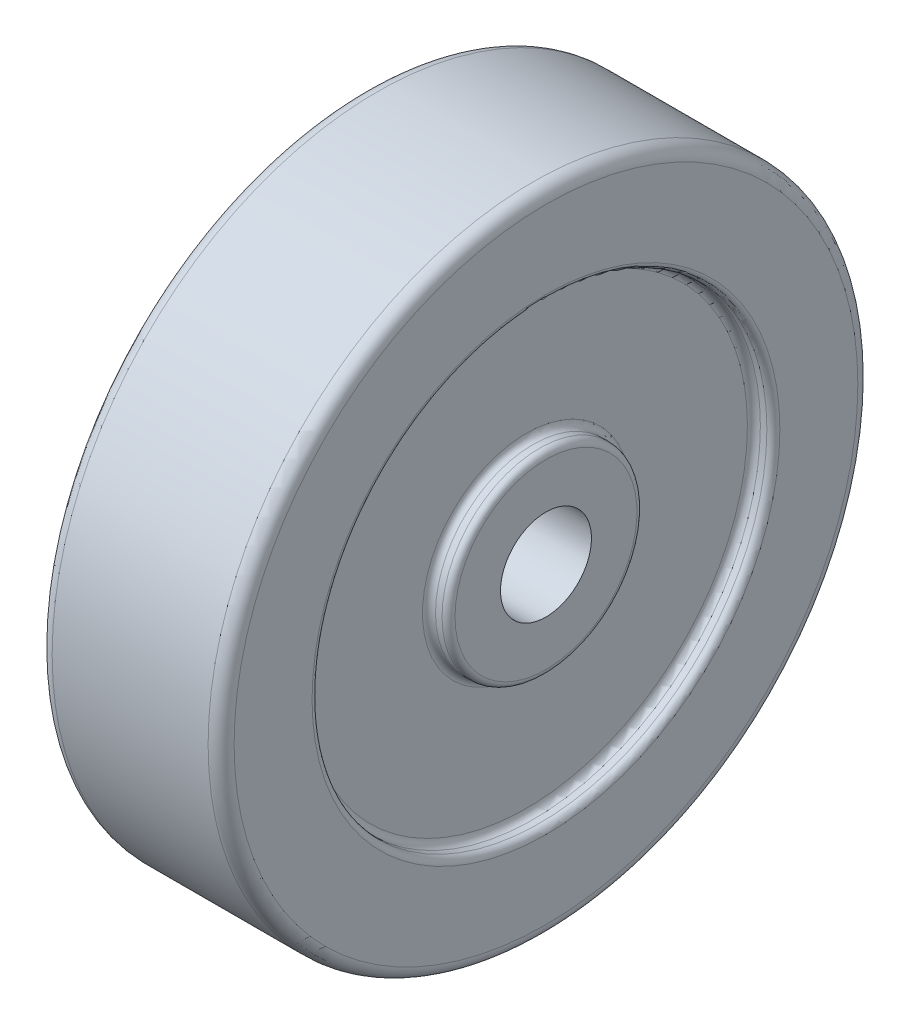
ISO-10303-21;
HEADER;
FILE_DESCRIPTION(('STEP AP214'),'2;1');
FILE_NAME('part.step','',(''),(''),'','','');
FILE_SCHEMA(('AUTOMOTIVE_DESIGN { 1 0 10303 214 1 1 1 1 }'));
ENDSEC;
DATA;
#1=APPLICATION_CONTEXT('core data for automotive mechanical design processes');
#2=APPLICATION_PROTOCOL_DEFINITION('international standard','automotive_design',2000,#1);
#3=PRODUCT_CONTEXT('',#1,'mechanical');
#4=PRODUCT('Part','Part','',(#3));
#5=PRODUCT_RELATED_PRODUCT_CATEGORY('part','',(#4));
#6=PRODUCT_DEFINITION_FORMATION('','',#4);
#7=PRODUCT_DEFINITION_CONTEXT('part definition',#1,'design');
#8=PRODUCT_DEFINITION('design','',#6,#7);
#9=PRODUCT_DEFINITION_SHAPE('','',#8);
#10=(LENGTH_UNIT() NAMED_UNIT(*) SI_UNIT(.MILLI.,.METRE.));
#11=(NAMED_UNIT(*) PLANE_ANGLE_UNIT() SI_UNIT($,.RADIAN.));
#12=(NAMED_UNIT(*) SI_UNIT($,.STERADIAN.) SOLID_ANGLE_UNIT());
#13=UNCERTAINTY_MEASURE_WITH_UNIT(LENGTH_MEASURE(1.E-05),#10,'distance_accuracy_value','');
#14=(GEOMETRIC_REPRESENTATION_CONTEXT(3) GLOBAL_UNCERTAINTY_ASSIGNED_CONTEXT((#13)) GLOBAL_UNIT_ASSIGNED_CONTEXT((#10,
#11,#12)) REPRESENTATION_CONTEXT('',''));
#15=CARTESIAN_POINT('',(0.,0.,0.));
#16=DIRECTION('',(0.,0.,1.));
#17=DIRECTION('',(1.,0.,0.));
#18=AXIS2_PLACEMENT_3D('',#15,#16,#17);
#19=CARTESIAN_POINT('',(-14.,0.,0.));
#20=DIRECTION('',(-1.,0.,0.));
#21=DIRECTION('',(0.,0.,1.));
#22=AXIS2_PLACEMENT_3D('',#19,#20,#21);
#23=CYLINDRICAL_SURFACE('',#22,7.);
#24=CARTESIAN_POINT('',(14.,0.,0.));
#25=DIRECTION('',(-1.,0.,0.));
#26=DIRECTION('',(0.,0.,1.));
#27=AXIS2_PLACEMENT_3D('',#24,#25,#26);
#28=CIRCLE('',#27,7.);
#29=CARTESIAN_POINT('',(14.,0.,7.));
#30=VERTEX_POINT('',#29);
#31=EDGE_CURVE('E104',#30,#30,#28,.T.);
#32=ORIENTED_EDGE('',*,*,#31,.F.);
#33=EDGE_LOOP('',(#32));
#34=FACE_BOUND('',#33,.T.);
#35=CARTESIAN_POINT('',(-14.,0.,0.));
#36=DIRECTION('',(-1.,0.,0.));
#37=DIRECTION('',(0.,0.,1.));
#38=AXIS2_PLACEMENT_3D('',#35,#36,#37);
#39=CIRCLE('',#38,7.);
#40=CARTESIAN_POINT('',(-14.,0.,7.));
#41=VERTEX_POINT('',#40);
#42=EDGE_CURVE('E107',#41,#41,#39,.T.);
#43=ORIENTED_EDGE('',*,*,#42,.T.);
#44=EDGE_LOOP('',(#43));
#45=FACE_BOUND('',#44,.T.);
#46=ADVANCED_FACE('F40',(#34,#45),#23,.F.);
#47=CARTESIAN_POINT('',(14.,0.,0.));
#48=DIRECTION('',(-1.,0.,0.));
#49=DIRECTION('',(0.,0.,1.));
#50=AXIS2_PLACEMENT_3D('',#47,#48,#49);
#51=PLANE('',#50);
#52=CARTESIAN_POINT('',(14.,0.,0.));
#53=DIRECTION('',(-1.,0.,0.));
#54=DIRECTION('',(0.,0.,1.));
#55=AXIS2_PLACEMENT_3D('',#52,#53,#54);
#56=CIRCLE('',#55,14.);
#57=CARTESIAN_POINT('',(14.,0.,14.));
#58=VERTEX_POINT('',#57);
#59=EDGE_CURVE('E55',#58,#58,#56,.F.);
#60=ORIENTED_EDGE('',*,*,#59,.T.);
#61=EDGE_LOOP('',(#60));
#62=FACE_BOUND('',#61,.T.);
#63=ORIENTED_EDGE('',*,*,#31,.T.);
#64=EDGE_LOOP('',(#63));
#65=FACE_BOUND('',#64,.T.);
#66=ADVANCED_FACE('F135',(#62,#65),#51,.F.);
#67=CARTESIAN_POINT('',(-14.,0.,0.));
#68=DIRECTION('',(-1.,0.,0.));
#69=DIRECTION('',(0.,0.,1.));
#70=AXIS2_PLACEMENT_3D('',#67,#68,#69);
#71=CYLINDRICAL_SURFACE('',#70,15.);
#72=CARTESIAN_POINT('',(12.,0.,0.));
#73=DIRECTION('',(1.,0.,0.));
#74=DIRECTION('',(0.,0.,-1.));
#75=AXIS2_PLACEMENT_3D('',#72,#73,#74);
#76=CIRCLE('',#75,15.);
#77=CARTESIAN_POINT('',(12.,0.,-15.));
#78=VERTEX_POINT('',#77);
#79=EDGE_CURVE('E60',#78,#78,#76,.T.);
#80=ORIENTED_EDGE('',*,*,#79,.T.);
#81=EDGE_LOOP('',(#80));
#82=FACE_BOUND('',#81,.T.);
#83=CARTESIAN_POINT('',(13.,0.,0.));
#84=DIRECTION('',(-1.,0.,0.));
#85=DIRECTION('',(0.,0.,1.));
#86=AXIS2_PLACEMENT_3D('',#83,#84,#85);
#87=CIRCLE('',#86,15.);
#88=CARTESIAN_POINT('',(13.,0.,15.));
#89=VERTEX_POINT('',#88);
#90=EDGE_CURVE('E58',#89,#89,#87,.T.);
#91=ORIENTED_EDGE('',*,*,#90,.T.);
#92=EDGE_LOOP('',(#91));
#93=FACE_BOUND('',#92,.T.);
#94=ADVANCED_FACE('F128',(#82,#93),#71,.T.);
#95=CARTESIAN_POINT('',(11.,0.,0.));
#96=DIRECTION('',(1.,0.,0.));
#97=DIRECTION('',(0.,0.,-1.));
#98=AXIS2_PLACEMENT_3D('',#95,#96,#97);
#99=PLANE('',#98);
#100=CARTESIAN_POINT('',(11.,0.,0.));
#101=DIRECTION('',(1.,0.,0.));
#102=DIRECTION('',(0.,0.,-1.));
#103=AXIS2_PLACEMENT_3D('',#100,#101,#102);
#104=CIRCLE('',#103,16.);
#105=CARTESIAN_POINT('',(11.,0.,-16.));
#106=VERTEX_POINT('',#105);
#107=EDGE_CURVE('E62',#106,#106,#104,.F.);
#108=ORIENTED_EDGE('',*,*,#107,.T.);
#109=EDGE_LOOP('',(#108));
#110=FACE_BOUND('',#109,.T.);
#111=CARTESIAN_POINT('',(11.,0.,0.));
#112=DIRECTION('',(1.,0.,0.));
#113=DIRECTION('',(0.,0.,-1.));
#114=AXIS2_PLACEMENT_3D('',#111,#112,#113);
#115=CIRCLE('',#114,34.);
#116=CARTESIAN_POINT('',(11.,0.,-34.));
#117=VERTEX_POINT('',#116);
#118=EDGE_CURVE('E68',#117,#117,#115,.T.);
#119=ORIENTED_EDGE('',*,*,#118,.T.);
#120=EDGE_LOOP('',(#119));
#121=FACE_BOUND('',#120,.T.);
#122=ADVANCED_FACE('F179',(#110,#121),#99,.T.);
#123=CARTESIAN_POINT('',(-14.,0.,0.));
#124=DIRECTION('',(-1.,0.,0.));
#125=DIRECTION('',(0.,0.,1.));
#126=AXIS2_PLACEMENT_3D('',#123,#124,#125);
#127=CYLINDRICAL_SURFACE('',#126,35.);
#128=CARTESIAN_POINT('',(12.,0.,0.));
#129=DIRECTION('',(1.,0.,0.));
#130=DIRECTION('',(0.,0.,-1.));
#131=AXIS2_PLACEMENT_3D('',#128,#129,#130);
#132=CIRCLE('',#131,35.);
#133=CARTESIAN_POINT('',(12.,0.,-35.));
#134=VERTEX_POINT('',#133);
#135=EDGE_CURVE('E42',#134,#134,#132,.F.);
#136=ORIENTED_EDGE('',*,*,#135,.T.);
#137=EDGE_LOOP('',(#136));
#138=FACE_BOUND('',#137,.T.);
#139=CARTESIAN_POINT('',(13.,0.,0.));
#140=DIRECTION('',(1.,0.,0.));
#141=DIRECTION('',(0.,0.,-1.));
#142=AXIS2_PLACEMENT_3D('',#139,#140,#141);
#143=CIRCLE('',#142,35.);
#144=CARTESIAN_POINT('',(13.,0.,-35.));
#145=VERTEX_POINT('',#144);
#146=EDGE_CURVE('E48',#145,#145,#143,.T.);
#147=ORIENTED_EDGE('',*,*,#146,.T.);
#148=EDGE_LOOP('',(#147));
#149=FACE_BOUND('',#148,.T.);
#150=ADVANCED_FACE('F182',(#138,#149),#127,.F.);
#151=CARTESIAN_POINT('',(14.,0.,0.));
#152=DIRECTION('',(1.,0.,0.));
#153=DIRECTION('',(0.,0.,-1.));
#154=AXIS2_PLACEMENT_3D('',#151,#152,#153);
#155=PLANE('',#154);
#156=CARTESIAN_POINT('',(14.,0.,0.));
#157=DIRECTION('',(1.,0.,0.));
#158=DIRECTION('',(0.,0.,-1.));
#159=AXIS2_PLACEMENT_3D('',#156,#157,#158);
#160=CIRCLE('',#159,36.);
#161=CARTESIAN_POINT('',(14.,0.,-36.));
#162=VERTEX_POINT('',#161);
#163=EDGE_CURVE('E10',#162,#162,#160,.F.);
#164=ORIENTED_EDGE('',*,*,#163,.T.);
#165=EDGE_LOOP('',(#164));
#166=FACE_BOUND('',#165,.T.);
#167=CARTESIAN_POINT('',(14.,0.,0.));
#168=DIRECTION('',(1.,0.,0.));
#169=DIRECTION('',(0.,0.,-1.));
#170=AXIS2_PLACEMENT_3D('',#167,#168,#169);
#171=CIRCLE('',#170,48.);
#172=CARTESIAN_POINT('',(14.,0.,-48.));
#173=VERTEX_POINT('',#172);
#174=EDGE_CURVE('E91',#173,#173,#171,.T.);
#175=ORIENTED_EDGE('',*,*,#174,.T.);
#176=EDGE_LOOP('',(#175));
#177=FACE_BOUND('',#176,.T.);
#178=ADVANCED_FACE('F190',(#166,#177),#155,.T.);
#179=CARTESIAN_POINT('',(-14.,0.,0.));
#180=DIRECTION('',(-1.,0.,0.));
#181=DIRECTION('',(0.,0.,1.));
#182=AXIS2_PLACEMENT_3D('',#179,#180,#181);
#183=CYLINDRICAL_SURFACE('',#182,50.);
#184=CARTESIAN_POINT('',(-12.,0.,0.));
#185=DIRECTION('',(1.,0.,0.));
#186=DIRECTION('',(0.,0.,-1.));
#187=AXIS2_PLACEMENT_3D('',#184,#185,#186);
#188=CIRCLE('',#187,50.);
#189=CARTESIAN_POINT('',(-12.,0.,-50.));
#190=VERTEX_POINT('',#189);
#191=EDGE_CURVE('E96',#190,#190,#188,.T.);
#192=ORIENTED_EDGE('',*,*,#191,.T.);
#193=EDGE_LOOP('',(#192));
#194=FACE_BOUND('',#193,.T.);
#195=CARTESIAN_POINT('',(12.,0.,0.));
#196=DIRECTION('',(1.,0.,0.));
#197=DIRECTION('',(0.,0.,-1.));
#198=AXIS2_PLACEMENT_3D('',#195,#196,#197);
#199=CIRCLE('',#198,50.);
#200=CARTESIAN_POINT('',(12.,0.,-50.));
#201=VERTEX_POINT('',#200);
#202=EDGE_CURVE('E97',#201,#201,#199,.F.);
#203=ORIENTED_EDGE('',*,*,#202,.T.);
#204=EDGE_LOOP('',(#203));
#205=FACE_BOUND('',#204,.T.);
#206=ADVANCED_FACE('F194',(#194,#205),#183,.T.);
#207=CARTESIAN_POINT('',(-14.,0.,0.));
#208=DIRECTION('',(1.,0.,0.));
#209=DIRECTION('',(0.,0.,-1.));
#210=AXIS2_PLACEMENT_3D('',#207,#208,#209);
#211=PLANE('',#210);
#212=CARTESIAN_POINT('',(-14.,0.,0.));
#213=DIRECTION('',(1.,0.,0.));
#214=DIRECTION('',(0.,0.,-1.));
#215=AXIS2_PLACEMENT_3D('',#212,#213,#214);
#216=CIRCLE('',#215,36.);
#217=CARTESIAN_POINT('',(-14.,0.,-36.));
#218=VERTEX_POINT('',#217);
#219=EDGE_CURVE('E69',#218,#218,#216,.T.);
#220=ORIENTED_EDGE('',*,*,#219,.T.);
#221=EDGE_LOOP('',(#220));
#222=FACE_BOUND('',#221,.T.);
#223=CARTESIAN_POINT('',(-14.,0.,0.));
#224=DIRECTION('',(1.,0.,0.));
#225=DIRECTION('',(0.,0.,-1.));
#226=AXIS2_PLACEMENT_3D('',#223,#224,#225);
#227=CIRCLE('',#226,48.);
#228=CARTESIAN_POINT('',(-14.,0.,-48.));
#229=VERTEX_POINT('',#228);
#230=EDGE_CURVE('E105',#229,#229,#227,.F.);
#231=ORIENTED_EDGE('',*,*,#230,.T.);
#232=EDGE_LOOP('',(#231));
#233=FACE_BOUND('',#232,.T.);
#234=ADVANCED_FACE('F198',(#222,#233),#211,.F.);
#235=CARTESIAN_POINT('',(-12.,0.,0.));
#236=DIRECTION('',(1.,0.,0.));
#237=DIRECTION('',(0.,0.,-1.));
#238=AXIS2_PLACEMENT_3D('',#235,#236,#237);
#239=CIRCLE('',#238,35.);
#240=CARTESIAN_POINT('',(-12.,0.,-35.));
#241=VERTEX_POINT('',#240);
#242=EDGE_CURVE('E75',#241,#241,#239,.T.);
#243=ORIENTED_EDGE('',*,*,#242,.T.);
#244=EDGE_LOOP('',(#243));
#245=FACE_BOUND('',#244,.T.);
#246=CARTESIAN_POINT('',(-13.,0.,0.));
#247=DIRECTION('',(1.,0.,0.));
#248=DIRECTION('',(0.,0.,-1.));
#249=AXIS2_PLACEMENT_3D('',#246,#247,#248);
#250=CIRCLE('',#249,35.);
#251=CARTESIAN_POINT('',(-13.,0.,-35.));
#252=VERTEX_POINT('',#251);
#253=EDGE_CURVE('E73',#252,#252,#250,.F.);
#254=ORIENTED_EDGE('',*,*,#253,.T.);
#255=EDGE_LOOP('',(#254));
#256=FACE_BOUND('',#255,.T.);
#257=ADVANCED_FACE('F188',(#245,#256),#127,.F.);
#258=CARTESIAN_POINT('',(-11.,0.,0.));
#259=DIRECTION('',(1.,0.,0.));
#260=DIRECTION('',(0.,0.,-1.));
#261=AXIS2_PLACEMENT_3D('',#258,#259,#260);
#262=PLANE('',#261);
#263=CARTESIAN_POINT('',(-11.,0.,0.));
#264=DIRECTION('',(1.,0.,0.));
#265=DIRECTION('',(0.,0.,-1.));
#266=AXIS2_PLACEMENT_3D('',#263,#264,#265);
#267=CIRCLE('',#266,16.);
#268=CARTESIAN_POINT('',(-11.,0.,-16.));
#269=VERTEX_POINT('',#268);
#270=EDGE_CURVE('E77',#269,#269,#267,.T.);
#271=ORIENTED_EDGE('',*,*,#270,.T.);
#272=EDGE_LOOP('',(#271));
#273=FACE_BOUND('',#272,.T.);
#274=CARTESIAN_POINT('',(-11.,0.,0.));
#275=DIRECTION('',(1.,0.,0.));
#276=DIRECTION('',(0.,0.,-1.));
#277=AXIS2_PLACEMENT_3D('',#274,#275,#276);
#278=CIRCLE('',#277,34.);
#279=CARTESIAN_POINT('',(-11.,0.,-34.));
#280=VERTEX_POINT('',#279);
#281=EDGE_CURVE('E83',#280,#280,#278,.F.);
#282=ORIENTED_EDGE('',*,*,#281,.T.);
#283=EDGE_LOOP('',(#282));
#284=FACE_BOUND('',#283,.T.);
#285=ADVANCED_FACE('F130',(#273,#284),#262,.F.);
#286=CARTESIAN_POINT('',(-13.,0.,0.));
#287=DIRECTION('',(-1.,0.,0.));
#288=DIRECTION('',(0.,0.,1.));
#289=AXIS2_PLACEMENT_3D('',#286,#287,#288);
#290=CIRCLE('',#289,15.);
#291=CARTESIAN_POINT('',(-13.,0.,15.));
#292=VERTEX_POINT('',#291);
#293=EDGE_CURVE('E84',#292,#292,#290,.F.);
#294=ORIENTED_EDGE('',*,*,#293,.T.);
#295=EDGE_LOOP('',(#294));
#296=FACE_BOUND('',#295,.T.);
#297=CARTESIAN_POINT('',(-12.,0.,0.));
#298=DIRECTION('',(1.,0.,0.));
#299=DIRECTION('',(0.,0.,-1.));
#300=AXIS2_PLACEMENT_3D('',#297,#298,#299);
#301=CIRCLE('',#300,15.);
#302=CARTESIAN_POINT('',(-12.,0.,-15.));
#303=VERTEX_POINT('',#302);
#304=EDGE_CURVE('E87',#303,#303,#301,.F.);
#305=ORIENTED_EDGE('',*,*,#304,.T.);
#306=EDGE_LOOP('',(#305));
#307=FACE_BOUND('',#306,.T.);
#308=ADVANCED_FACE('F116',(#296,#307),#71,.T.);
#309=CARTESIAN_POINT('',(-14.,0.,0.));
#310=DIRECTION('',(-1.,0.,0.));
#311=DIRECTION('',(0.,0.,1.));
#312=AXIS2_PLACEMENT_3D('',#309,#310,#311);
#313=PLANE('',#312);
#314=CARTESIAN_POINT('',(-14.,0.,0.));
#315=DIRECTION('',(-1.,0.,0.));
#316=DIRECTION('',(0.,0.,1.));
#317=AXIS2_PLACEMENT_3D('',#314,#315,#316);
#318=CIRCLE('',#317,14.);
#319=CARTESIAN_POINT('',(-14.,0.,14.));
#320=VERTEX_POINT('',#319);
#321=EDGE_CURVE('E89',#320,#320,#318,.T.);
#322=ORIENTED_EDGE('',*,*,#321,.T.);
#323=EDGE_LOOP('',(#322));
#324=FACE_BOUND('',#323,.T.);
#325=ORIENTED_EDGE('',*,*,#42,.F.);
#326=EDGE_LOOP('',(#325));
#327=FACE_BOUND('',#326,.T.);
#328=ADVANCED_FACE('F114',(#324,#327),#313,.T.);
#329=CARTESIAN_POINT('',(-12.,0.,0.));
#330=DIRECTION('',(1.,0.,0.));
#331=DIRECTION('',(0.,0.,-1.));
#332=AXIS2_PLACEMENT_3D('',#329,#330,#331);
#333=TOROIDAL_SURFACE('',#332,48.,2.);
#334=ORIENTED_EDGE('',*,*,#191,.F.);
#335=EDGE_LOOP('',(#334));
#336=FACE_BOUND('',#335,.T.);
#337=ORIENTED_EDGE('',*,*,#230,.F.);
#338=EDGE_LOOP('',(#337));
#339=FACE_BOUND('',#338,.T.);
#340=ADVANCED_FACE('F113',(#336,#339),#333,.T.);
#341=CARTESIAN_POINT('',(12.,0.,0.));
#342=DIRECTION('',(1.,0.,0.));
#343=DIRECTION('',(0.,0.,-1.));
#344=AXIS2_PLACEMENT_3D('',#341,#342,#343);
#345=TOROIDAL_SURFACE('',#344,48.,2.);
#346=ORIENTED_EDGE('',*,*,#174,.F.);
#347=EDGE_LOOP('',(#346));
#348=FACE_BOUND('',#347,.T.);
#349=ORIENTED_EDGE('',*,*,#202,.F.);
#350=EDGE_LOOP('',(#349));
#351=FACE_BOUND('',#350,.T.);
#352=ADVANCED_FACE('F124',(#348,#351),#345,.T.);
#353=CARTESIAN_POINT('',(-13.,0.,0.));
#354=DIRECTION('',(-1.,0.,0.));
#355=DIRECTION('',(0.,0.,1.));
#356=AXIS2_PLACEMENT_3D('',#353,#354,#355);
#357=TOROIDAL_SURFACE('',#356,14.,1.);
#358=ORIENTED_EDGE('',*,*,#293,.F.);
#359=EDGE_LOOP('',(#358));
#360=FACE_BOUND('',#359,.T.);
#361=ORIENTED_EDGE('',*,*,#321,.F.);
#362=EDGE_LOOP('',(#361));
#363=FACE_BOUND('',#362,.T.);
#364=ADVANCED_FACE('F148',(#360,#363),#357,.T.);
#365=CARTESIAN_POINT('',(-12.,0.,0.));
#366=DIRECTION('',(1.,0.,0.));
#367=DIRECTION('',(0.,0.,-1.));
#368=AXIS2_PLACEMENT_3D('',#365,#366,#367);
#369=TOROIDAL_SURFACE('',#368,16.,1.);
#370=ORIENTED_EDGE('',*,*,#270,.F.);
#371=EDGE_LOOP('',(#370));
#372=FACE_BOUND('',#371,.T.);
#373=ORIENTED_EDGE('',*,*,#304,.F.);
#374=EDGE_LOOP('',(#373));
#375=FACE_BOUND('',#374,.T.);
#376=ADVANCED_FACE('F149',(#372,#375),#369,.F.);
#377=CARTESIAN_POINT('',(-12.,0.,0.));
#378=DIRECTION('',(1.,0.,0.));
#379=DIRECTION('',(0.,0.,-1.));
#380=AXIS2_PLACEMENT_3D('',#377,#378,#379);
#381=TOROIDAL_SURFACE('',#380,34.,1.);
#382=ORIENTED_EDGE('',*,*,#242,.F.);
#383=EDGE_LOOP('',(#382));
#384=FACE_BOUND('',#383,.T.);
#385=ORIENTED_EDGE('',*,*,#281,.F.);
#386=EDGE_LOOP('',(#385));
#387=FACE_BOUND('',#386,.T.);
#388=ADVANCED_FACE('F153',(#384,#387),#381,.F.);
#389=CARTESIAN_POINT('',(-13.,0.,0.));
#390=DIRECTION('',(1.,0.,0.));
#391=DIRECTION('',(0.,0.,-1.));
#392=AXIS2_PLACEMENT_3D('',#389,#390,#391);
#393=TOROIDAL_SURFACE('',#392,36.,1.);
#394=ORIENTED_EDGE('',*,*,#219,.F.);
#395=EDGE_LOOP('',(#394));
#396=FACE_BOUND('',#395,.T.);
#397=ORIENTED_EDGE('',*,*,#253,.F.);
#398=EDGE_LOOP('',(#397));
#399=FACE_BOUND('',#398,.T.);
#400=ADVANCED_FACE('F160',(#396,#399),#393,.T.);
#401=CARTESIAN_POINT('',(12.,0.,0.));
#402=DIRECTION('',(1.,0.,0.));
#403=DIRECTION('',(0.,0.,-1.));
#404=AXIS2_PLACEMENT_3D('',#401,#402,#403);
#405=TOROIDAL_SURFACE('',#404,16.,1.);
#406=ORIENTED_EDGE('',*,*,#79,.F.);
#407=EDGE_LOOP('',(#406));
#408=FACE_BOUND('',#407,.T.);
#409=ORIENTED_EDGE('',*,*,#107,.F.);
#410=EDGE_LOOP('',(#409));
#411=FACE_BOUND('',#410,.T.);
#412=ADVANCED_FACE('F161',(#408,#411),#405,.F.);
#413=CARTESIAN_POINT('',(13.,0.,0.));
#414=DIRECTION('',(-1.,0.,0.));
#415=DIRECTION('',(0.,0.,1.));
#416=AXIS2_PLACEMENT_3D('',#413,#414,#415);
#417=TOROIDAL_SURFACE('',#416,14.,1.);
#418=ORIENTED_EDGE('',*,*,#59,.F.);
#419=EDGE_LOOP('',(#418));
#420=FACE_BOUND('',#419,.T.);
#421=ORIENTED_EDGE('',*,*,#90,.F.);
#422=EDGE_LOOP('',(#421));
#423=FACE_BOUND('',#422,.T.);
#424=ADVANCED_FACE('F164',(#420,#423),#417,.T.);
#425=CARTESIAN_POINT('',(12.,0.,0.));
#426=DIRECTION('',(1.,0.,0.));
#427=DIRECTION('',(0.,0.,-1.));
#428=AXIS2_PLACEMENT_3D('',#425,#426,#427);
#429=TOROIDAL_SURFACE('',#428,34.,1.);
#430=ORIENTED_EDGE('',*,*,#118,.F.);
#431=EDGE_LOOP('',(#430));
#432=FACE_BOUND('',#431,.T.);
#433=ORIENTED_EDGE('',*,*,#135,.F.);
#434=EDGE_LOOP('',(#433));
#435=FACE_BOUND('',#434,.T.);
#436=ADVANCED_FACE('F169',(#432,#435),#429,.F.);
#437=CARTESIAN_POINT('',(13.,0.,0.));
#438=DIRECTION('',(1.,0.,0.));
#439=DIRECTION('',(0.,0.,-1.));
#440=AXIS2_PLACEMENT_3D('',#437,#438,#439);
#441=TOROIDAL_SURFACE('',#440,36.,1.);
#442=ORIENTED_EDGE('',*,*,#146,.F.);
#443=EDGE_LOOP('',(#442));
#444=FACE_BOUND('',#443,.T.);
#445=ORIENTED_EDGE('',*,*,#163,.F.);
#446=EDGE_LOOP('',(#445));
#447=FACE_BOUND('',#446,.T.);
#448=ADVANCED_FACE('F39',(#444,#447),#441,.T.);
#449=CLOSED_SHELL('',(#46,#66,#94,#122,#150,#178,#206,#234,#257,#285,#308,#328,#340,#352,#364,
#376,#388,#400,#412,#424,#436,#448));
#450=MANIFOLD_SOLID_BREP('B2',#449);
#451=ADVANCED_BREP_SHAPE_REPRESENTATION('',(#18,#450),#14);
#452=SHAPE_DEFINITION_REPRESENTATION(#9,#451);
ENDSEC;
END-ISO-10303-21;
